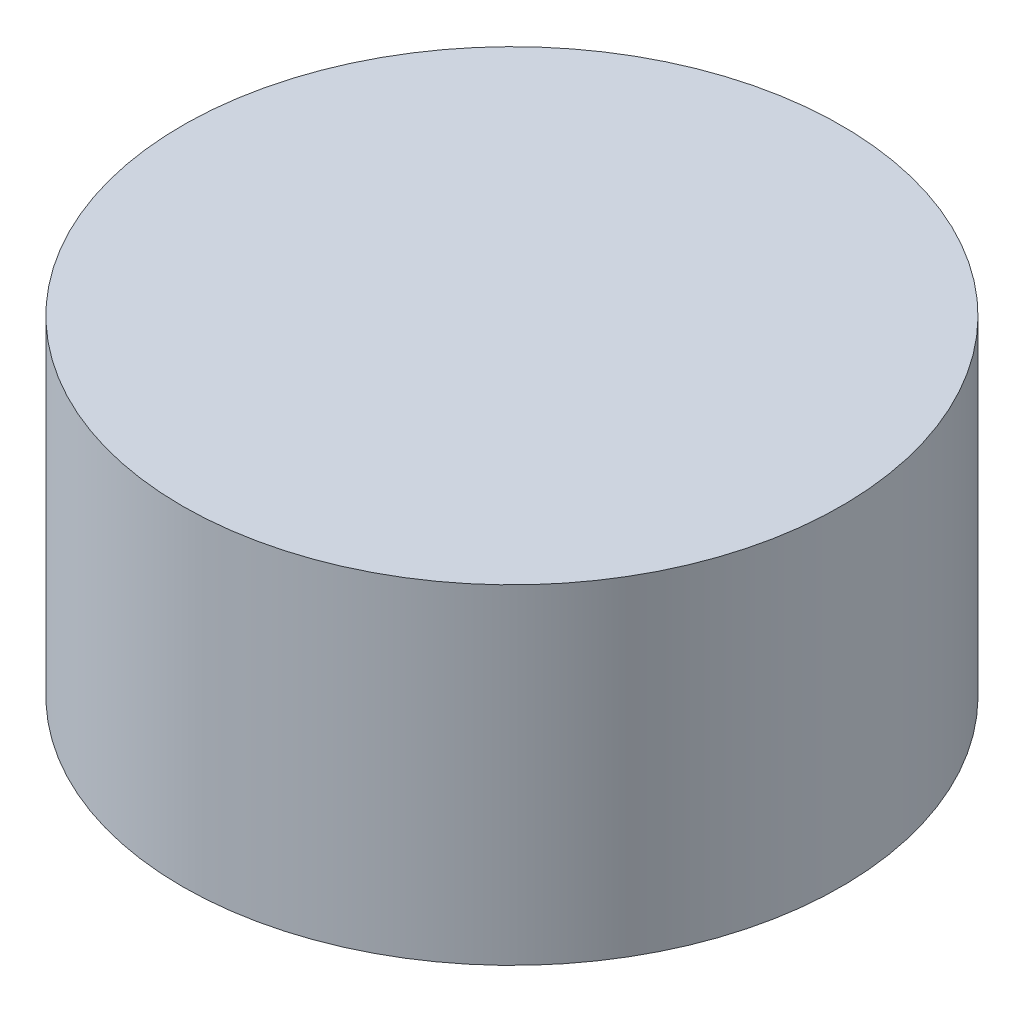
ISO-10303-21;
HEADER;
FILE_DESCRIPTION(('STEP AP214'),'2;1');
FILE_NAME('part.step','',(''),(''),'','','');
FILE_SCHEMA(('AUTOMOTIVE_DESIGN { 1 0 10303 214 1 1 1 1 }'));
ENDSEC;
DATA;
#1=APPLICATION_CONTEXT('core data for automotive mechanical design processes');
#2=APPLICATION_PROTOCOL_DEFINITION('international standard','automotive_design',2000,#1);
#3=PRODUCT_CONTEXT('',#1,'mechanical');
#4=PRODUCT('Part','Part','',(#3));
#5=PRODUCT_RELATED_PRODUCT_CATEGORY('part','',(#4));
#6=PRODUCT_DEFINITION_FORMATION('','',#4);
#7=PRODUCT_DEFINITION_CONTEXT('part definition',#1,'design');
#8=PRODUCT_DEFINITION('design','',#6,#7);
#9=PRODUCT_DEFINITION_SHAPE('','',#8);
#10=(LENGTH_UNIT() NAMED_UNIT(*) SI_UNIT(.MILLI.,.METRE.));
#11=(NAMED_UNIT(*) PLANE_ANGLE_UNIT() SI_UNIT($,.RADIAN.));
#12=(NAMED_UNIT(*) SI_UNIT($,.STERADIAN.) SOLID_ANGLE_UNIT());
#13=UNCERTAINTY_MEASURE_WITH_UNIT(LENGTH_MEASURE(1.E-05),#10,'distance_accuracy_value','');
#14=(GEOMETRIC_REPRESENTATION_CONTEXT(3) GLOBAL_UNCERTAINTY_ASSIGNED_CONTEXT((#13)) GLOBAL_UNIT_ASSIGNED_CONTEXT((#10,
#11,#12)) REPRESENTATION_CONTEXT('',''));
#15=CARTESIAN_POINT('',(0.,0.,0.));
#16=DIRECTION('',(0.,0.,1.));
#17=DIRECTION('',(1.,0.,0.));
#18=AXIS2_PLACEMENT_3D('',#15,#16,#17);
#19=CARTESIAN_POINT('',(0.,225.,0.));
#20=DIRECTION('',(0.,-1.,0.));
#21=DIRECTION('',(0.,0.,-1.));
#22=AXIS2_PLACEMENT_3D('',#19,#20,#21);
#23=CYLINDRICAL_SURFACE('',#22,35.);
#24=CARTESIAN_POINT('',(0.,225.,0.));
#25=DIRECTION('',(0.,1.,0.));
#26=DIRECTION('',(0.,0.,1.));
#27=AXIS2_PLACEMENT_3D('',#24,#25,#26);
#28=CIRCLE('',#27,35.);
#29=CARTESIAN_POINT('',(0.,225.,35.));
#30=VERTEX_POINT('',#29);
#31=EDGE_CURVE('E10',#30,#30,#28,.T.);
#32=ORIENTED_EDGE('',*,*,#31,.F.);
#33=EDGE_LOOP('',(#32));
#34=FACE_BOUND('',#33,.T.);
#35=CARTESIAN_POINT('',(0.,190.,0.));
#36=DIRECTION('',(0.,1.,0.));
#37=DIRECTION('',(0.,0.,1.));
#38=AXIS2_PLACEMENT_3D('',#35,#36,#37);
#39=CIRCLE('',#38,35.);
#40=CARTESIAN_POINT('',(0.,190.,35.));
#41=VERTEX_POINT('',#40);
#42=EDGE_CURVE('E40',#41,#41,#39,.T.);
#43=ORIENTED_EDGE('',*,*,#42,.T.);
#44=EDGE_LOOP('',(#43));
#45=FACE_BOUND('',#44,.T.);
#46=ADVANCED_FACE('F37',(#34,#45),#23,.T.);
#47=CARTESIAN_POINT('',(0.,225.,0.));
#48=DIRECTION('',(0.,1.,0.));
#49=DIRECTION('',(0.,0.,1.));
#50=AXIS2_PLACEMENT_3D('',#47,#48,#49);
#51=PLANE('',#50);
#52=ORIENTED_EDGE('',*,*,#31,.T.);
#53=EDGE_LOOP('',(#52));
#54=FACE_BOUND('',#53,.T.);
#55=ADVANCED_FACE('F52',(#54),#51,.T.);
#56=CARTESIAN_POINT('',(0.,190.,0.));
#57=DIRECTION('',(0.,1.,0.));
#58=DIRECTION('',(0.,0.,1.));
#59=AXIS2_PLACEMENT_3D('',#56,#57,#58);
#60=PLANE('',#59);
#61=ORIENTED_EDGE('',*,*,#42,.F.);
#62=EDGE_LOOP('',(#61));
#63=FACE_BOUND('',#62,.T.);
#64=ADVANCED_FACE('F50',(#63),#60,.F.);
#65=CLOSED_SHELL('',(#46,#55,#64));
#66=MANIFOLD_SOLID_BREP('B2',#65);
#67=ADVANCED_BREP_SHAPE_REPRESENTATION('',(#18,#66),#14);
#68=SHAPE_DEFINITION_REPRESENTATION(#9,#67);
ENDSEC;
END-ISO-10303-21;
